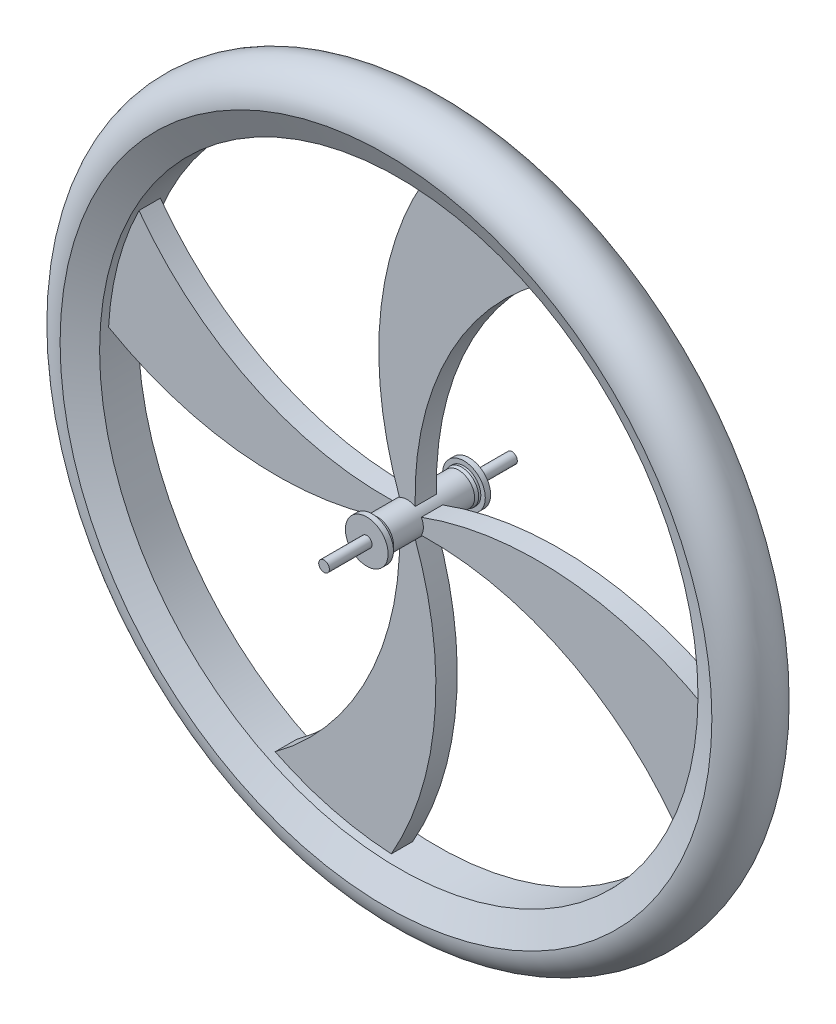
ISO-10303-21;
HEADER;
FILE_DESCRIPTION(('STEP AP214'),'2;1');
FILE_NAME('part.step','',(''),(''),'','','');
FILE_SCHEMA(('AUTOMOTIVE_DESIGN { 1 0 10303 214 1 1 1 1 }'));
ENDSEC;
DATA;
#1=APPLICATION_CONTEXT('core data for automotive mechanical design processes');
#2=APPLICATION_PROTOCOL_DEFINITION('international standard','automotive_design',2000,#1);
#3=PRODUCT_CONTEXT('',#1,'mechanical');
#4=PRODUCT('Part','Part','',(#3));
#5=PRODUCT_RELATED_PRODUCT_CATEGORY('part','',(#4));
#6=PRODUCT_DEFINITION_FORMATION('','',#4);
#7=PRODUCT_DEFINITION_CONTEXT('part definition',#1,'design');
#8=PRODUCT_DEFINITION('design','',#6,#7);
#9=PRODUCT_DEFINITION_SHAPE('','',#8);
#10=(LENGTH_UNIT() NAMED_UNIT(*) SI_UNIT(.MILLI.,.METRE.));
#11=(NAMED_UNIT(*) PLANE_ANGLE_UNIT() SI_UNIT($,.RADIAN.));
#12=(NAMED_UNIT(*) SI_UNIT($,.STERADIAN.) SOLID_ANGLE_UNIT());
#13=UNCERTAINTY_MEASURE_WITH_UNIT(LENGTH_MEASURE(1.E-05),#10,'distance_accuracy_value','');
#14=(GEOMETRIC_REPRESENTATION_CONTEXT(3) GLOBAL_UNCERTAINTY_ASSIGNED_CONTEXT((#13)) GLOBAL_UNIT_ASSIGNED_CONTEXT((#10,
#11,#12)) REPRESENTATION_CONTEXT('',''));
#15=CARTESIAN_POINT('',(0.,0.,0.));
#16=DIRECTION('',(0.,0.,1.));
#17=DIRECTION('',(1.,0.,0.));
#18=AXIS2_PLACEMENT_3D('',#15,#16,#17);
#19=CARTESIAN_POINT('',(0.,0.,38.));
#20=DIRECTION('',(0.,0.,-1.));
#21=DIRECTION('',(-1.,0.,0.));
#22=AXIS2_PLACEMENT_3D('',#19,#20,#21);
#23=CYLINDRICAL_SURFACE('',#22,15.);
#24=CARTESIAN_POINT('',(0.,0.,10.));
#25=DIRECTION('',(0.,0.,-1.));
#26=DIRECTION('',(-1.,0.,0.));
#27=AXIS2_PLACEMENT_3D('',#24,#25,#26);
#28=CIRCLE('',#27,15.0000000000005);
#29=CARTESIAN_POINT('',(7.32038317779105,-13.0924401900606,10.));
#30=VERTEX_POINT('',#29);
#31=CARTESIAN_POINT('',(-7.32038317780992,-13.0924401900512,10.));
#32=VERTEX_POINT('',#31);
#33=EDGE_CURVE('E188',#30,#32,#28,.T.);
#34=ORIENTED_EDGE('',*,*,#33,.F.);
#35=DIRECTION('',(0.,0.,-1.));
#36=VECTOR('',#35,1.);
#37=CARTESIAN_POINT('',(7.32038317779105,-13.0924401900606,10.));
#38=LINE('',#37,#36);
#39=CARTESIAN_POINT('',(7.32038317779105,-13.0924401900606,-10.));
#40=VERTEX_POINT('',#39);
#41=EDGE_CURVE('E201',#30,#40,#38,.T.);
#42=ORIENTED_EDGE('',*,*,#41,.T.);
#43=CARTESIAN_POINT('',(0.,0.,-10.));
#44=DIRECTION('',(0.,0.,-1.));
#45=DIRECTION('',(-1.,0.,0.));
#46=AXIS2_PLACEMENT_3D('',#43,#44,#45);
#47=CIRCLE('',#46,15.0000000000005);
#48=CARTESIAN_POINT('',(-7.3203831778094,-13.0924401900503,-10.));
#49=VERTEX_POINT('',#48);
#50=EDGE_CURVE('E177',#40,#49,#47,.T.);
#51=ORIENTED_EDGE('',*,*,#50,.T.);
#52=DIRECTION('',(0.,0.,-1.));
#53=VECTOR('',#52,1.);
#54=CARTESIAN_POINT('',(-7.32038317780992,-13.0924401900512,10.));
#55=LINE('',#54,#53);
#56=EDGE_CURVE('E222',#32,#49,#55,.T.);
#57=ORIENTED_EDGE('',*,*,#56,.F.);
#58=EDGE_LOOP('',(#34,#42,#51,#57));
#59=FACE_BOUND('',#58,.T.);
#60=CARTESIAN_POINT('',(0.,0.,10.));
#61=DIRECTION('',(0.,0.,-1.));
#62=DIRECTION('',(-1.,0.,0.));
#63=AXIS2_PLACEMENT_3D('',#60,#61,#62);
#64=CIRCLE('',#63,15.0000000000005);
#65=CARTESIAN_POINT('',(-7.3203831777911,13.0924401900605,10.));
#66=VERTEX_POINT('',#65);
#67=CARTESIAN_POINT('',(7.32038317780992,13.0924401900513,10.));
#68=VERTEX_POINT('',#67);
#69=EDGE_CURVE('E280',#66,#68,#64,.T.);
#70=ORIENTED_EDGE('',*,*,#69,.F.);
#71=DIRECTION('',(0.,0.,-1.));
#72=VECTOR('',#71,1.);
#73=CARTESIAN_POINT('',(-7.3203831777911,13.0924401900605,10.));
#74=LINE('',#73,#72);
#75=CARTESIAN_POINT('',(-7.3203831777911,13.0924401900605,-10.));
#76=VERTEX_POINT('',#75);
#77=EDGE_CURVE('E294',#66,#76,#74,.T.);
#78=ORIENTED_EDGE('',*,*,#77,.T.);
#79=CARTESIAN_POINT('',(0.,0.,-10.));
#80=DIRECTION('',(0.,0.,-1.));
#81=DIRECTION('',(-1.,0.,0.));
#82=AXIS2_PLACEMENT_3D('',#79,#80,#81);
#83=CIRCLE('',#82,15.0000000000005);
#84=CARTESIAN_POINT('',(7.32038317780938,13.0924401900503,-10.));
#85=VERTEX_POINT('',#84);
#86=EDGE_CURVE('E279',#76,#85,#83,.T.);
#87=ORIENTED_EDGE('',*,*,#86,.T.);
#88=DIRECTION('',(0.,0.,-1.));
#89=VECTOR('',#88,1.);
#90=CARTESIAN_POINT('',(7.32038317780992,13.0924401900513,10.));
#91=LINE('',#90,#89);
#92=EDGE_CURVE('E318',#68,#85,#91,.T.);
#93=ORIENTED_EDGE('',*,*,#92,.F.);
#94=EDGE_LOOP('',(#70,#78,#87,#93));
#95=FACE_BOUND('',#94,.T.);
#96=CARTESIAN_POINT('',(0.,0.,38.));
#97=DIRECTION('',(0.,0.,1.));
#98=DIRECTION('',(1.,0.,0.));
#99=AXIS2_PLACEMENT_3D('',#96,#97,#98);
#100=CIRCLE('',#99,15.);
#101=CARTESIAN_POINT('',(15.,0.,38.));
#102=VERTEX_POINT('',#101);
#103=EDGE_CURVE('E44',#102,#102,#100,.T.);
#104=ORIENTED_EDGE('',*,*,#103,.F.);
#105=EDGE_LOOP('',(#104));
#106=FACE_BOUND('',#105,.T.);
#107=CARTESIAN_POINT('',(0.,0.,-38.));
#108=DIRECTION('',(0.,0.,1.));
#109=DIRECTION('',(1.,0.,0.));
#110=AXIS2_PLACEMENT_3D('',#107,#108,#109);
#111=CIRCLE('',#110,15.);
#112=CARTESIAN_POINT('',(15.,0.,-38.));
#113=VERTEX_POINT('',#112);
#114=EDGE_CURVE('E331',#113,#113,#111,.T.);
#115=ORIENTED_EDGE('',*,*,#114,.T.);
#116=EDGE_LOOP('',(#115));
#117=FACE_BOUND('',#116,.T.);
#118=CARTESIAN_POINT('',(0.,0.,10.));
#119=DIRECTION('',(0.,0.,-1.));
#120=DIRECTION('',(-1.,0.,0.));
#121=AXIS2_PLACEMENT_3D('',#118,#119,#120);
#122=CIRCLE('',#121,15.0000000000005);
#123=CARTESIAN_POINT('',(13.0924401900606,7.32038317779105,10.));
#124=VERTEX_POINT('',#123);
#125=CARTESIAN_POINT('',(13.0924401900513,-7.32038317780992,10.));
#126=VERTEX_POINT('',#125);
#127=EDGE_CURVE('E226',#124,#126,#122,.T.);
#128=ORIENTED_EDGE('',*,*,#127,.F.);
#129=DIRECTION('',(0.,0.,-1.));
#130=VECTOR('',#129,1.);
#131=CARTESIAN_POINT('',(13.0924401900606,7.32038317779105,10.));
#132=LINE('',#131,#130);
#133=CARTESIAN_POINT('',(13.0924401900606,7.32038317779105,-10.));
#134=VERTEX_POINT('',#133);
#135=EDGE_CURVE('E240',#124,#134,#132,.T.);
#136=ORIENTED_EDGE('',*,*,#135,.T.);
#137=CARTESIAN_POINT('',(0.,0.,-10.));
#138=DIRECTION('',(0.,0.,-1.));
#139=DIRECTION('',(-1.,0.,0.));
#140=AXIS2_PLACEMENT_3D('',#137,#138,#139);
#141=CIRCLE('',#140,15.0000000000005);
#142=CARTESIAN_POINT('',(13.0924401900503,-7.3203831778094,-10.));
#143=VERTEX_POINT('',#142);
#144=EDGE_CURVE('E225',#134,#143,#141,.T.);
#145=ORIENTED_EDGE('',*,*,#144,.T.);
#146=DIRECTION('',(0.,0.,-1.));
#147=VECTOR('',#146,1.);
#148=CARTESIAN_POINT('',(13.0924401900513,-7.32038317780992,10.));
#149=LINE('',#148,#147);
#150=EDGE_CURVE('E264',#126,#143,#149,.T.);
#151=ORIENTED_EDGE('',*,*,#150,.F.);
#152=EDGE_LOOP('',(#128,#136,#145,#151));
#153=FACE_BOUND('',#152,.T.);
#154=CARTESIAN_POINT('',(0.,0.,10.));
#155=DIRECTION('',(0.,0.,-1.));
#156=DIRECTION('',(-1.,0.,0.));
#157=AXIS2_PLACEMENT_3D('',#154,#155,#156);
#158=CIRCLE('',#157,15.0000000000005);
#159=CARTESIAN_POINT('',(-13.0924401900606,-7.32038317779105,10.));
#160=VERTEX_POINT('',#159);
#161=CARTESIAN_POINT('',(-13.0924401900511,7.32038317780992,10.));
#162=VERTEX_POINT('',#161);
#163=EDGE_CURVE('E163',#160,#162,#158,.T.);
#164=ORIENTED_EDGE('',*,*,#163,.F.);
#165=DIRECTION('',(0.,0.,-1.));
#166=VECTOR('',#165,1.);
#167=CARTESIAN_POINT('',(-13.0924401900606,-7.32038317779105,10.));
#168=LINE('',#167,#166);
#169=CARTESIAN_POINT('',(-13.0924401900606,-7.32038317779105,-10.));
#170=VERTEX_POINT('',#169);
#171=EDGE_CURVE('E409',#160,#170,#168,.T.);
#172=ORIENTED_EDGE('',*,*,#171,.T.);
#173=CARTESIAN_POINT('',(0.,0.,-10.));
#174=DIRECTION('',(0.,0.,-1.));
#175=DIRECTION('',(-1.,0.,0.));
#176=AXIS2_PLACEMENT_3D('',#173,#174,#175);
#177=CIRCLE('',#176,15.0000000000005);
#178=CARTESIAN_POINT('',(-13.0924401900503,7.32038317780946,-10.));
#179=VERTEX_POINT('',#178);
#180=EDGE_CURVE('E175',#170,#179,#177,.T.);
#181=ORIENTED_EDGE('',*,*,#180,.T.);
#182=DIRECTION('',(0.,0.,-1.));
#183=VECTOR('',#182,1.);
#184=CARTESIAN_POINT('',(-13.0924401900511,7.32038317780992,10.));
#185=LINE('',#184,#183);
#186=EDGE_CURVE('E57',#162,#179,#185,.T.);
#187=ORIENTED_EDGE('',*,*,#186,.F.);
#188=EDGE_LOOP('',(#164,#172,#181,#187));
#189=FACE_BOUND('',#188,.T.);
#190=ADVANCED_FACE('F41',(#59,#95,#106,#117,#153,#189),#23,.T.);
#191=CARTESIAN_POINT('',(0.,0.,38.));
#192=DIRECTION('',(0.,0.,1.));
#193=DIRECTION('',(1.,0.,0.));
#194=AXIS2_PLACEMENT_3D('',#191,#192,#193);
#195=CYLINDRICAL_SURFACE('',#194,280.2);
#196=CARTESIAN_POINT('',(0.,0.,10.));
#197=DIRECTION('',(0.,0.,1.));
#198=DIRECTION('',(1.,0.,0.));
#199=AXIS2_PLACEMENT_3D('',#196,#197,#198);
#200=CIRCLE('',#199,280.2);
#201=CARTESIAN_POINT('',(-123.80858993279,-251.3632293293,10.));
#202=VERTEX_POINT('',#201);
#203=CARTESIAN_POINT('',(-15.0000000000228,-279.798213003584,10.));
#204=VERTEX_POINT('',#203);
#205=EDGE_CURVE('E196',#202,#204,#200,.T.);
#206=ORIENTED_EDGE('',*,*,#205,.F.);
#207=DIRECTION('',(0.,0.,-1.));
#208=VECTOR('',#207,1.);
#209=CARTESIAN_POINT('',(-123.80858993279,-251.3632293293,10.));
#210=LINE('',#209,#208);
#211=CARTESIAN_POINT('',(-123.80858993279,-251.3632293293,-10.));
#212=VERTEX_POINT('',#211);
#213=EDGE_CURVE('E218',#202,#212,#210,.T.);
#214=ORIENTED_EDGE('',*,*,#213,.T.);
#215=CARTESIAN_POINT('',(0.,0.,-10.));
#216=DIRECTION('',(0.,0.,1.));
#217=DIRECTION('',(1.,0.,0.));
#218=AXIS2_PLACEMENT_3D('',#215,#216,#217);
#219=CIRCLE('',#218,280.2);
#220=CARTESIAN_POINT('',(-15.0000000000229,-279.798213003584,-10.));
#221=VERTEX_POINT('',#220);
#222=EDGE_CURVE('E205',#212,#221,#219,.T.);
#223=ORIENTED_EDGE('',*,*,#222,.T.);
#224=DIRECTION('',(0.,0.,-1.));
#225=VECTOR('',#224,1.);
#226=CARTESIAN_POINT('',(-15.0000000000228,-279.798213003584,10.));
#227=LINE('',#226,#225);
#228=EDGE_CURVE('E214',#204,#221,#227,.T.);
#229=ORIENTED_EDGE('',*,*,#228,.F.);
#230=EDGE_LOOP('',(#206,#214,#223,#229));
#231=FACE_BOUND('',#230,.T.);
#232=DIRECTION('',(0.,0.,-1.));
#233=VECTOR('',#232,1.);
#234=CARTESIAN_POINT('',(15.0000000000229,279.798213003585,10.));
#235=LINE('',#234,#233);
#236=CARTESIAN_POINT('',(15.0000000000229,279.798213003585,10.));
#237=VERTEX_POINT('',#236);
#238=CARTESIAN_POINT('',(15.0000000000229,279.798213003585,-10.));
#239=VERTEX_POINT('',#238);
#240=EDGE_CURVE('E310',#237,#239,#235,.T.);
#241=ORIENTED_EDGE('',*,*,#240,.F.);
#242=CARTESIAN_POINT('',(0.,0.,10.));
#243=DIRECTION('',(0.,0.,1.));
#244=DIRECTION('',(1.,0.,0.));
#245=AXIS2_PLACEMENT_3D('',#242,#243,#244);
#246=CIRCLE('',#245,280.2);
#247=CARTESIAN_POINT('',(123.80858993279,251.3632293293,10.));
#248=VERTEX_POINT('',#247);
#249=EDGE_CURVE('E288',#248,#237,#246,.T.);
#250=ORIENTED_EDGE('',*,*,#249,.F.);
#251=DIRECTION('',(0.,0.,-1.));
#252=VECTOR('',#251,1.);
#253=CARTESIAN_POINT('',(123.80858993279,251.3632293293,10.));
#254=LINE('',#253,#252);
#255=CARTESIAN_POINT('',(123.80858993279,251.3632293293,-10.));
#256=VERTEX_POINT('',#255);
#257=EDGE_CURVE('E314',#248,#256,#254,.T.);
#258=ORIENTED_EDGE('',*,*,#257,.T.);
#259=CARTESIAN_POINT('',(0.,0.,-10.));
#260=DIRECTION('',(0.,0.,1.));
#261=DIRECTION('',(1.,0.,0.));
#262=AXIS2_PLACEMENT_3D('',#259,#260,#261);
#263=CIRCLE('',#262,280.2);
#264=EDGE_CURVE('E301',#256,#239,#263,.T.);
#265=ORIENTED_EDGE('',*,*,#264,.T.);
#266=EDGE_LOOP('',(#241,#250,#258,#265));
#267=FACE_BOUND('',#266,.T.);
#268=CARTESIAN_POINT('',(0.,0.,18.));
#269=DIRECTION('',(0.,0.,1.));
#270=DIRECTION('',(1.,0.,0.));
#271=AXIS2_PLACEMENT_3D('',#268,#269,#270);
#272=CIRCLE('',#271,280.2);
#273=CARTESIAN_POINT('',(280.2,0.,18.));
#274=VERTEX_POINT('',#273);
#275=EDGE_CURVE('E271',#274,#274,#272,.T.);
#276=ORIENTED_EDGE('',*,*,#275,.T.);
#277=EDGE_LOOP('',(#276));
#278=FACE_BOUND('',#277,.T.);
#279=CARTESIAN_POINT('',(0.,0.,-18.));
#280=DIRECTION('',(0.,0.,1.));
#281=DIRECTION('',(1.,0.,0.));
#282=AXIS2_PLACEMENT_3D('',#279,#280,#281);
#283=CIRCLE('',#282,280.2);
#284=CARTESIAN_POINT('',(280.2,0.,-18.));
#285=VERTEX_POINT('',#284);
#286=EDGE_CURVE('E275',#285,#285,#283,.T.);
#287=ORIENTED_EDGE('',*,*,#286,.F.);
#288=EDGE_LOOP('',(#287));
#289=FACE_BOUND('',#288,.T.);
#290=CARTESIAN_POINT('',(0.,0.,10.));
#291=DIRECTION('',(0.,0.,1.));
#292=DIRECTION('',(1.,0.,0.));
#293=AXIS2_PLACEMENT_3D('',#290,#291,#292);
#294=CIRCLE('',#293,280.2);
#295=CARTESIAN_POINT('',(251.3632293293,-123.80858993279,10.));
#296=VERTEX_POINT('',#295);
#297=CARTESIAN_POINT('',(279.798213003585,-15.0000000000229,10.));
#298=VERTEX_POINT('',#297);
#299=EDGE_CURVE('E234',#296,#298,#294,.T.);
#300=ORIENTED_EDGE('',*,*,#299,.F.);
#301=DIRECTION('',(0.,0.,-1.));
#302=VECTOR('',#301,1.);
#303=CARTESIAN_POINT('',(251.3632293293,-123.80858993279,10.));
#304=LINE('',#303,#302);
#305=CARTESIAN_POINT('',(251.3632293293,-123.80858993279,-10.));
#306=VERTEX_POINT('',#305);
#307=EDGE_CURVE('E260',#296,#306,#304,.T.);
#308=ORIENTED_EDGE('',*,*,#307,.T.);
#309=CARTESIAN_POINT('',(0.,0.,-10.));
#310=DIRECTION('',(0.,0.,1.));
#311=DIRECTION('',(1.,0.,0.));
#312=AXIS2_PLACEMENT_3D('',#309,#310,#311);
#313=CIRCLE('',#312,280.2);
#314=CARTESIAN_POINT('',(279.798213003585,-15.0000000000229,-10.));
#315=VERTEX_POINT('',#314);
#316=EDGE_CURVE('E247',#306,#315,#313,.T.);
#317=ORIENTED_EDGE('',*,*,#316,.T.);
#318=DIRECTION('',(0.,0.,-1.));
#319=VECTOR('',#318,1.);
#320=CARTESIAN_POINT('',(279.798213003585,-15.0000000000229,10.));
#321=LINE('',#320,#319);
#322=EDGE_CURVE('E256',#298,#315,#321,.T.);
#323=ORIENTED_EDGE('',*,*,#322,.F.);
#324=EDGE_LOOP('',(#300,#308,#317,#323));
#325=FACE_BOUND('',#324,.T.);
#326=CARTESIAN_POINT('',(0.,0.,10.));
#327=DIRECTION('',(0.,0.,1.));
#328=DIRECTION('',(1.,0.,0.));
#329=AXIS2_PLACEMENT_3D('',#326,#327,#328);
#330=CIRCLE('',#329,280.2);
#331=CARTESIAN_POINT('',(-251.3632293293,123.80858993279,10.));
#332=VERTEX_POINT('',#331);
#333=CARTESIAN_POINT('',(-279.798213003585,15.0000000000229,10.));
#334=VERTEX_POINT('',#333);
#335=EDGE_CURVE('E162',#332,#334,#330,.T.);
#336=ORIENTED_EDGE('',*,*,#335,.F.);
#337=DIRECTION('',(0.,0.,-1.));
#338=VECTOR('',#337,1.);
#339=CARTESIAN_POINT('',(-251.3632293293,123.80858993279,10.));
#340=LINE('',#339,#338);
#341=CARTESIAN_POINT('',(-251.3632293293,123.80858993279,-10.));
#342=VERTEX_POINT('',#341);
#343=EDGE_CURVE('E158',#332,#342,#340,.T.);
#344=ORIENTED_EDGE('',*,*,#343,.T.);
#345=CARTESIAN_POINT('',(0.,0.,-10.));
#346=DIRECTION('',(0.,0.,1.));
#347=DIRECTION('',(1.,0.,0.));
#348=AXIS2_PLACEMENT_3D('',#345,#346,#347);
#349=CIRCLE('',#348,280.2);
#350=CARTESIAN_POINT('',(-279.798213003585,15.0000000000229,-10.));
#351=VERTEX_POINT('',#350);
#352=EDGE_CURVE('E418',#342,#351,#349,.T.);
#353=ORIENTED_EDGE('',*,*,#352,.T.);
#354=DIRECTION('',(0.,0.,-1.));
#355=VECTOR('',#354,1.);
#356=CARTESIAN_POINT('',(-279.798213003585,15.0000000000229,10.));
#357=LINE('',#356,#355);
#358=EDGE_CURVE('E184',#334,#351,#357,.T.);
#359=ORIENTED_EDGE('',*,*,#358,.F.);
#360=EDGE_LOOP('',(#336,#344,#353,#359));
#361=FACE_BOUND('',#360,.T.);
#362=ADVANCED_FACE('F377',(#231,#267,#278,#289,#325,#361),#195,.F.);
#363=CARTESIAN_POINT('',(0.,0.,38.));
#364=DIRECTION('',(0.,0.,1.));
#365=DIRECTION('',(1.,0.,0.));
#366=AXIS2_PLACEMENT_3D('',#363,#364,#365);
#367=CONICAL_SURFACE('',#366,15.,0.26179938779915);
#368=CARTESIAN_POINT('',(0.,0.,41.));
#369=DIRECTION('',(0.,0.,1.));
#370=DIRECTION('',(1.,0.,0.));
#371=AXIS2_PLACEMENT_3D('',#368,#369,#370);
#372=CIRCLE('',#371,15.8038475772934);
#373=CARTESIAN_POINT('',(15.8038475772934,0.,41.));
#374=VERTEX_POINT('',#373);
#375=EDGE_CURVE('E364',#374,#374,#372,.T.);
#376=ORIENTED_EDGE('',*,*,#375,.F.);
#377=EDGE_LOOP('',(#376));
#378=FACE_BOUND('',#377,.T.);
#379=ORIENTED_EDGE('',*,*,#103,.T.);
#380=EDGE_LOOP('',(#379));
#381=FACE_BOUND('',#380,.T.);
#382=ADVANCED_FACE('F373',(#378,#381),#367,.T.);
#383=CARTESIAN_POINT('',(0.,0.,43.));
#384=DIRECTION('',(0.,0.,-1.));
#385=DIRECTION('',(-1.,0.,0.));
#386=AXIS2_PLACEMENT_3D('',#383,#384,#385);
#387=CYLINDRICAL_SURFACE('',#386,15.8038475772934);
#388=CARTESIAN_POINT('',(0.,0.,43.));
#389=DIRECTION('',(0.,0.,1.));
#390=DIRECTION('',(1.,0.,0.));
#391=AXIS2_PLACEMENT_3D('',#388,#389,#390);
#392=CIRCLE('',#391,15.8038475772934);
#393=CARTESIAN_POINT('',(15.8038475772934,0.,43.));
#394=VERTEX_POINT('',#393);
#395=EDGE_CURVE('E358',#394,#394,#392,.T.);
#396=ORIENTED_EDGE('',*,*,#395,.F.);
#397=EDGE_LOOP('',(#396));
#398=FACE_BOUND('',#397,.T.);
#399=ORIENTED_EDGE('',*,*,#375,.T.);
#400=EDGE_LOOP('',(#399));
#401=FACE_BOUND('',#400,.T.);
#402=ADVANCED_FACE('F538',(#398,#401),#387,.T.);
#403=CARTESIAN_POINT('',(0.,0.,48.));
#404=DIRECTION('',(0.,0.,-1.));
#405=DIRECTION('',(-1.,0.,0.));
#406=AXIS2_PLACEMENT_3D('',#403,#404,#405);
#407=CYLINDRICAL_SURFACE('',#406,20.);
#408=CARTESIAN_POINT('',(0.,0.,48.));
#409=DIRECTION('',(0.,0.,1.));
#410=DIRECTION('',(1.,0.,0.));
#411=AXIS2_PLACEMENT_3D('',#408,#409,#410);
#412=CIRCLE('',#411,20.);
#413=CARTESIAN_POINT('',(20.,0.,48.));
#414=VERTEX_POINT('',#413);
#415=EDGE_CURVE('E354',#414,#414,#412,.T.);
#416=ORIENTED_EDGE('',*,*,#415,.F.);
#417=EDGE_LOOP('',(#416));
#418=FACE_BOUND('',#417,.T.);
#419=CARTESIAN_POINT('',(0.,0.,43.));
#420=DIRECTION('',(0.,0.,1.));
#421=DIRECTION('',(1.,0.,0.));
#422=AXIS2_PLACEMENT_3D('',#419,#420,#421);
#423=CIRCLE('',#422,20.);
#424=CARTESIAN_POINT('',(20.,0.,43.));
#425=VERTEX_POINT('',#424);
#426=EDGE_CURVE('E352',#425,#425,#423,.T.);
#427=ORIENTED_EDGE('',*,*,#426,.T.);
#428=EDGE_LOOP('',(#427));
#429=FACE_BOUND('',#428,.T.);
#430=ADVANCED_FACE('F531',(#418,#429),#407,.T.);
#431=CARTESIAN_POINT('',(0.,0.,48.));
#432=DIRECTION('',(0.,0.,1.));
#433=DIRECTION('',(1.,0.,0.));
#434=AXIS2_PLACEMENT_3D('',#431,#432,#433);
#435=PLANE('',#434);
#436=CARTESIAN_POINT('',(0.,0.,48.));
#437=DIRECTION('',(0.,0.,1.));
#438=DIRECTION('',(1.,0.,0.));
#439=AXIS2_PLACEMENT_3D('',#436,#437,#438);
#440=CIRCLE('',#439,5.);
#441=CARTESIAN_POINT('',(5.,0.,48.));
#442=VERTEX_POINT('',#441);
#443=EDGE_CURVE('E11',#442,#442,#440,.T.);
#444=ORIENTED_EDGE('',*,*,#443,.F.);
#445=EDGE_LOOP('',(#444));
#446=FACE_BOUND('',#445,.T.);
#447=ORIENTED_EDGE('',*,*,#415,.T.);
#448=EDGE_LOOP('',(#447));
#449=FACE_BOUND('',#448,.T.);
#450=ADVANCED_FACE('F528',(#446,#449),#435,.T.);
#451=CARTESIAN_POINT('',(0.,0.,43.));
#452=DIRECTION('',(0.,0.,1.));
#453=DIRECTION('',(1.,0.,0.));
#454=AXIS2_PLACEMENT_3D('',#451,#452,#453);
#455=PLANE('',#454);
#456=ORIENTED_EDGE('',*,*,#395,.T.);
#457=EDGE_LOOP('',(#456));
#458=FACE_BOUND('',#457,.T.);
#459=ORIENTED_EDGE('',*,*,#426,.F.);
#460=EDGE_LOOP('',(#459));
#461=FACE_BOUND('',#460,.T.);
#462=ADVANCED_FACE('F526',(#458,#461),#455,.F.);
#463=CARTESIAN_POINT('',(0.,0.,88.));
#464=DIRECTION('',(0.,0.,-1.));
#465=DIRECTION('',(-1.,0.,0.));
#466=AXIS2_PLACEMENT_3D('',#463,#464,#465);
#467=CYLINDRICAL_SURFACE('',#466,5.);
#468=CARTESIAN_POINT('',(0.,0.,88.));
#469=DIRECTION('',(0.,0.,1.));
#470=DIRECTION('',(1.,0.,0.));
#471=AXIS2_PLACEMENT_3D('',#468,#469,#470);
#472=CIRCLE('',#471,5.);
#473=CARTESIAN_POINT('',(5.,0.,88.));
#474=VERTEX_POINT('',#473);
#475=EDGE_CURVE('E330',#474,#474,#472,.T.);
#476=ORIENTED_EDGE('',*,*,#475,.F.);
#477=EDGE_LOOP('',(#476));
#478=FACE_BOUND('',#477,.T.);
#479=ORIENTED_EDGE('',*,*,#443,.T.);
#480=EDGE_LOOP('',(#479));
#481=FACE_BOUND('',#480,.T.);
#482=ADVANCED_FACE('F522',(#478,#481),#467,.T.);
#483=CARTESIAN_POINT('',(0.,0.,88.));
#484=DIRECTION('',(0.,0.,1.));
#485=DIRECTION('',(1.,0.,0.));
#486=AXIS2_PLACEMENT_3D('',#483,#484,#485);
#487=PLANE('',#486);
#488=ORIENTED_EDGE('',*,*,#475,.T.);
#489=EDGE_LOOP('',(#488));
#490=FACE_BOUND('',#489,.T.);
#491=ADVANCED_FACE('F518',(#490),#487,.T.);
#492=CARTESIAN_POINT('',(0.,0.,-38.));
#493=DIRECTION('',(0.,0.,-1.));
#494=DIRECTION('',(1.,0.,0.));
#495=AXIS2_PLACEMENT_3D('',#492,#493,#494);
#496=CONICAL_SURFACE('',#495,15.,0.26179938779915);
#497=CARTESIAN_POINT('',(0.,0.,-41.));
#498=DIRECTION('',(0.,0.,1.));
#499=DIRECTION('',(1.,0.,0.));
#500=AXIS2_PLACEMENT_3D('',#497,#498,#499);
#501=CIRCLE('',#500,15.8038475772934);
#502=CARTESIAN_POINT('',(15.8038475772934,0.,-41.));
#503=VERTEX_POINT('',#502);
#504=EDGE_CURVE('E343',#503,#503,#501,.T.);
#505=ORIENTED_EDGE('',*,*,#504,.T.);
#506=EDGE_LOOP('',(#505));
#507=FACE_BOUND('',#506,.T.);
#508=ORIENTED_EDGE('',*,*,#114,.F.);
#509=EDGE_LOOP('',(#508));
#510=FACE_BOUND('',#509,.T.);
#511=ADVANCED_FACE('F514',(#507,#510),#496,.T.);
#512=CARTESIAN_POINT('',(0.,0.,-43.));
#513=DIRECTION('',(0.,0.,1.));
#514=DIRECTION('',(-1.,0.,0.));
#515=AXIS2_PLACEMENT_3D('',#512,#513,#514);
#516=CYLINDRICAL_SURFACE('',#515,15.8038475772934);
#517=CARTESIAN_POINT('',(0.,0.,-43.));
#518=DIRECTION('',(0.,0.,1.));
#519=DIRECTION('',(1.,0.,0.));
#520=AXIS2_PLACEMENT_3D('',#517,#518,#519);
#521=CIRCLE('',#520,15.8038475772934);
#522=CARTESIAN_POINT('',(15.8038475772934,0.,-43.));
#523=VERTEX_POINT('',#522);
#524=EDGE_CURVE('E336',#523,#523,#521,.T.);
#525=ORIENTED_EDGE('',*,*,#524,.T.);
#526=EDGE_LOOP('',(#525));
#527=FACE_BOUND('',#526,.T.);
#528=ORIENTED_EDGE('',*,*,#504,.F.);
#529=EDGE_LOOP('',(#528));
#530=FACE_BOUND('',#529,.T.);
#531=ADVANCED_FACE('F510',(#527,#530),#516,.T.);
#532=CARTESIAN_POINT('',(0.,0.,-48.));
#533=DIRECTION('',(0.,0.,1.));
#534=DIRECTION('',(-1.,0.,0.));
#535=AXIS2_PLACEMENT_3D('',#532,#533,#534);
#536=CYLINDRICAL_SURFACE('',#535,20.);
#537=CARTESIAN_POINT('',(0.,0.,-48.));
#538=DIRECTION('',(0.,0.,1.));
#539=DIRECTION('',(1.,0.,0.));
#540=AXIS2_PLACEMENT_3D('',#537,#538,#539);
#541=CIRCLE('',#540,20.);
#542=CARTESIAN_POINT('',(20.,0.,-48.));
#543=VERTEX_POINT('',#542);
#544=EDGE_CURVE('E332',#543,#543,#541,.T.);
#545=ORIENTED_EDGE('',*,*,#544,.T.);
#546=EDGE_LOOP('',(#545));
#547=FACE_BOUND('',#546,.T.);
#548=CARTESIAN_POINT('',(0.,0.,-43.));
#549=DIRECTION('',(0.,0.,1.));
#550=DIRECTION('',(1.,0.,0.));
#551=AXIS2_PLACEMENT_3D('',#548,#549,#550);
#552=CIRCLE('',#551,20.);
#553=CARTESIAN_POINT('',(20.,0.,-43.));
#554=VERTEX_POINT('',#553);
#555=EDGE_CURVE('E325',#554,#554,#552,.T.);
#556=ORIENTED_EDGE('',*,*,#555,.F.);
#557=EDGE_LOOP('',(#556));
#558=FACE_BOUND('',#557,.T.);
#559=ADVANCED_FACE('F503',(#547,#558),#536,.T.);
#560=CARTESIAN_POINT('',(0.,0.,-48.));
#561=DIRECTION('',(0.,0.,-1.));
#562=DIRECTION('',(1.,0.,0.));
#563=AXIS2_PLACEMENT_3D('',#560,#561,#562);
#564=PLANE('',#563);
#565=CARTESIAN_POINT('',(0.,0.,-48.));
#566=DIRECTION('',(0.,0.,1.));
#567=DIRECTION('',(1.,0.,0.));
#568=AXIS2_PLACEMENT_3D('',#565,#566,#567);
#569=CIRCLE('',#568,5.);
#570=CARTESIAN_POINT('',(5.,0.,-48.));
#571=VERTEX_POINT('',#570);
#572=EDGE_CURVE('E326',#571,#571,#569,.T.);
#573=ORIENTED_EDGE('',*,*,#572,.T.);
#574=EDGE_LOOP('',(#573));
#575=FACE_BOUND('',#574,.T.);
#576=ORIENTED_EDGE('',*,*,#544,.F.);
#577=EDGE_LOOP('',(#576));
#578=FACE_BOUND('',#577,.T.);
#579=ADVANCED_FACE('F500',(#575,#578),#564,.T.);
#580=CARTESIAN_POINT('',(0.,0.,-43.));
#581=DIRECTION('',(0.,0.,-1.));
#582=DIRECTION('',(1.,0.,0.));
#583=AXIS2_PLACEMENT_3D('',#580,#581,#582);
#584=PLANE('',#583);
#585=ORIENTED_EDGE('',*,*,#524,.F.);
#586=EDGE_LOOP('',(#585));
#587=FACE_BOUND('',#586,.T.);
#588=ORIENTED_EDGE('',*,*,#555,.T.);
#589=EDGE_LOOP('',(#588));
#590=FACE_BOUND('',#589,.T.);
#591=ADVANCED_FACE('F498',(#587,#590),#584,.F.);
#592=CARTESIAN_POINT('',(0.,0.,-88.));
#593=DIRECTION('',(0.,0.,1.));
#594=DIRECTION('',(-1.,0.,0.));
#595=AXIS2_PLACEMENT_3D('',#592,#593,#594);
#596=CYLINDRICAL_SURFACE('',#595,5.);
#597=CARTESIAN_POINT('',(0.,0.,-88.));
#598=DIRECTION('',(0.,0.,1.));
#599=DIRECTION('',(1.,0.,0.));
#600=AXIS2_PLACEMENT_3D('',#597,#598,#599);
#601=CIRCLE('',#600,5.);
#602=CARTESIAN_POINT('',(5.,0.,-88.));
#603=VERTEX_POINT('',#602);
#604=EDGE_CURVE('E321',#603,#603,#601,.T.);
#605=ORIENTED_EDGE('',*,*,#604,.T.);
#606=EDGE_LOOP('',(#605));
#607=FACE_BOUND('',#606,.T.);
#608=ORIENTED_EDGE('',*,*,#572,.F.);
#609=EDGE_LOOP('',(#608));
#610=FACE_BOUND('',#609,.T.);
#611=ADVANCED_FACE('F494',(#607,#610),#596,.T.);
#612=CARTESIAN_POINT('',(0.,0.,-88.));
#613=DIRECTION('',(0.,0.,-1.));
#614=DIRECTION('',(1.,0.,0.));
#615=AXIS2_PLACEMENT_3D('',#612,#613,#614);
#616=PLANE('',#615);
#617=ORIENTED_EDGE('',*,*,#604,.F.);
#618=EDGE_LOOP('',(#617));
#619=FACE_BOUND('',#618,.T.);
#620=ADVANCED_FACE('F490',(#619),#616,.T.);
#621=CARTESIAN_POINT('',(293.437777743411,20.8228608065085,10.));
#622=DIRECTION('',(0.,0.,-1.));
#623=DIRECTION('',(-1.,0.,0.));
#624=AXIS2_PLACEMENT_3D('',#621,#622,#623);
#625=CYLINDRICAL_SURFACE('',#624,286.221807128519);
#626=CARTESIAN_POINT('',(293.437777743411,20.8228608065085,-10.));
#627=DIRECTION('',(0.,0.,-1.));
#628=DIRECTION('',(-1.,0.,0.));
#629=AXIS2_PLACEMENT_3D('',#626,#627,#628);
#630=CIRCLE('',#629,286.221807128519);
#631=EDGE_CURVE('E298',#85,#256,#630,.T.);
#632=ORIENTED_EDGE('',*,*,#631,.T.);
#633=ORIENTED_EDGE('',*,*,#257,.F.);
#634=CARTESIAN_POINT('',(293.437777743411,20.8228608065085,10.));
#635=DIRECTION('',(0.,0.,-1.));
#636=DIRECTION('',(-1.,0.,0.));
#637=AXIS2_PLACEMENT_3D('',#634,#635,#636);
#638=CIRCLE('',#637,286.221807128519);
#639=EDGE_CURVE('E284',#68,#248,#638,.T.);
#640=ORIENTED_EDGE('',*,*,#639,.F.);
#641=ORIENTED_EDGE('',*,*,#92,.T.);
#642=EDGE_LOOP('',(#632,#633,#640,#641));
#643=FACE_BOUND('',#642,.T.);
#644=ADVANCED_FACE('F486',(#643),#625,.F.);
#645=CARTESIAN_POINT('',(290.8994051033,122.421548913097,10.));
#646=DIRECTION('',(0.,0.,-1.));
#647=DIRECTION('',(-1.,0.,0.));
#648=AXIS2_PLACEMENT_3D('',#645,#646,#647);
#649=CYLINDRICAL_SURFACE('',#648,317.628550569045);
#650=CARTESIAN_POINT('',(290.8994051033,122.421548913097,-10.));
#651=DIRECTION('',(0.,0.,1.));
#652=DIRECTION('',(-1.,0.,0.));
#653=AXIS2_PLACEMENT_3D('',#650,#651,#652);
#654=CIRCLE('',#653,317.628550569045);
#655=EDGE_CURVE('E285',#239,#76,#654,.T.);
#656=ORIENTED_EDGE('',*,*,#655,.T.);
#657=ORIENTED_EDGE('',*,*,#77,.F.);
#658=CARTESIAN_POINT('',(290.8994051033,122.421548913097,10.));
#659=DIRECTION('',(0.,0.,1.));
#660=DIRECTION('',(-1.,0.,0.));
#661=AXIS2_PLACEMENT_3D('',#658,#659,#660);
#662=CIRCLE('',#661,317.628550569045);
#663=EDGE_CURVE('E291',#237,#66,#662,.T.);
#664=ORIENTED_EDGE('',*,*,#663,.F.);
#665=ORIENTED_EDGE('',*,*,#240,.T.);
#666=EDGE_LOOP('',(#656,#657,#664,#665));
#667=FACE_BOUND('',#666,.T.);
#668=ADVANCED_FACE('F479',(#667),#649,.T.);
#669=CARTESIAN_POINT('',(146.718888871705,10.4114304032543,10.));
#670=DIRECTION('',(0.,0.,-1.));
#671=DIRECTION('',(-1.,0.,0.));
#672=AXIS2_PLACEMENT_3D('',#669,#670,#671);
#673=PLANE('',#672);
#674=ORIENTED_EDGE('',*,*,#69,.T.);
#675=ORIENTED_EDGE('',*,*,#639,.T.);
#676=ORIENTED_EDGE('',*,*,#249,.T.);
#677=ORIENTED_EDGE('',*,*,#663,.T.);
#678=EDGE_LOOP('',(#674,#675,#676,#677));
#679=FACE_BOUND('',#678,.T.);
#680=ADVANCED_FACE('F476',(#679),#673,.F.);
#681=CARTESIAN_POINT('',(146.718888871705,10.4114304032543,-10.));
#682=DIRECTION('',(0.,0.,-1.));
#683=DIRECTION('',(-1.,0.,0.));
#684=AXIS2_PLACEMENT_3D('',#681,#682,#683);
#685=PLANE('',#684);
#686=ORIENTED_EDGE('',*,*,#86,.F.);
#687=ORIENTED_EDGE('',*,*,#655,.F.);
#688=ORIENTED_EDGE('',*,*,#264,.F.);
#689=ORIENTED_EDGE('',*,*,#631,.F.);
#690=EDGE_LOOP('',(#686,#687,#688,#689));
#691=FACE_BOUND('',#690,.T.);
#692=ADVANCED_FACE('F474',(#691),#685,.T.);
#693=CARTESIAN_POINT('',(0.,0.,-18.));
#694=DIRECTION('',(0.,0.,-1.));
#695=DIRECTION('',(-1.,0.,0.));
#696=AXIS2_PLACEMENT_3D('',#693,#694,#695);
#697=CONICAL_SURFACE('',#696,280.2,1.12327635163773);
#698=CARTESIAN_POINT('',(0.,0.,-30.));
#699=DIRECTION('',(0.,0.,1.));
#700=DIRECTION('',(1.,0.,0.));
#701=AXIS2_PLACEMENT_3D('',#698,#699,#700);
#702=CIRCLE('',#701,305.2);
#703=CARTESIAN_POINT('',(305.2,0.,-30.));
#704=VERTEX_POINT('',#703);
#705=EDGE_CURVE('E267',#704,#704,#702,.T.);
#706=ORIENTED_EDGE('',*,*,#705,.F.);
#707=EDGE_LOOP('',(#706));
#708=FACE_BOUND('',#707,.T.);
#709=ORIENTED_EDGE('',*,*,#286,.T.);
#710=EDGE_LOOP('',(#709));
#711=FACE_BOUND('',#710,.T.);
#712=ADVANCED_FACE('F469',(#708,#711),#697,.F.);
#713=CARTESIAN_POINT('',(0.,0.,30.));
#714=DIRECTION('',(0.,0.,1.));
#715=DIRECTION('',(1.,0.,0.));
#716=AXIS2_PLACEMENT_3D('',#713,#714,#715);
#717=CONICAL_SURFACE('',#716,305.2,1.12327635163773);
#718=ORIENTED_EDGE('',*,*,#275,.F.);
#719=EDGE_LOOP('',(#718));
#720=FACE_BOUND('',#719,.T.);
#721=CARTESIAN_POINT('',(0.,0.,30.));
#722=DIRECTION('',(0.,0.,1.));
#723=DIRECTION('',(1.,0.,0.));
#724=AXIS2_PLACEMENT_3D('',#721,#722,#723);
#725=CIRCLE('',#724,305.2);
#726=CARTESIAN_POINT('',(305.2,0.,30.));
#727=VERTEX_POINT('',#726);
#728=EDGE_CURVE('E415',#727,#727,#725,.T.);
#729=ORIENTED_EDGE('',*,*,#728,.T.);
#730=EDGE_LOOP('',(#729));
#731=FACE_BOUND('',#730,.T.);
#732=ADVANCED_FACE('F467',(#720,#731),#717,.F.);
#733=CARTESIAN_POINT('',(20.8228608065086,-293.437777743411,10.));
#734=DIRECTION('',(0.,0.,-1.));
#735=DIRECTION('',(-1.,0.,0.));
#736=AXIS2_PLACEMENT_3D('',#733,#734,#735);
#737=CYLINDRICAL_SURFACE('',#736,286.221807128519);
#738=CARTESIAN_POINT('',(20.8228608065086,-293.437777743411,-10.));
#739=DIRECTION('',(0.,0.,-1.));
#740=DIRECTION('',(-1.,0.,0.));
#741=AXIS2_PLACEMENT_3D('',#738,#739,#740);
#742=CIRCLE('',#741,286.221807128519);
#743=EDGE_CURVE('E244',#143,#306,#742,.T.);
#744=ORIENTED_EDGE('',*,*,#743,.T.);
#745=ORIENTED_EDGE('',*,*,#307,.F.);
#746=CARTESIAN_POINT('',(20.8228608065086,-293.437777743411,10.));
#747=DIRECTION('',(0.,0.,-1.));
#748=DIRECTION('',(-1.,0.,0.));
#749=AXIS2_PLACEMENT_3D('',#746,#747,#748);
#750=CIRCLE('',#749,286.221807128519);
#751=EDGE_CURVE('E230',#126,#296,#750,.T.);
#752=ORIENTED_EDGE('',*,*,#751,.F.);
#753=ORIENTED_EDGE('',*,*,#150,.T.);
#754=EDGE_LOOP('',(#744,#745,#752,#753));
#755=FACE_BOUND('',#754,.T.);
#756=ADVANCED_FACE('F398',(#755),#737,.F.);
#757=CARTESIAN_POINT('',(122.421548913097,-290.8994051033,10.));
#758=DIRECTION('',(0.,0.,-1.));
#759=DIRECTION('',(-1.,0.,0.));
#760=AXIS2_PLACEMENT_3D('',#757,#758,#759);
#761=CYLINDRICAL_SURFACE('',#760,317.628550569045);
#762=CARTESIAN_POINT('',(122.421548913097,-290.8994051033,-10.));
#763=DIRECTION('',(0.,0.,1.));
#764=DIRECTION('',(-1.,0.,0.));
#765=AXIS2_PLACEMENT_3D('',#762,#763,#764);
#766=CIRCLE('',#765,317.628550569045);
#767=EDGE_CURVE('E231',#315,#134,#766,.T.);
#768=ORIENTED_EDGE('',*,*,#767,.T.);
#769=ORIENTED_EDGE('',*,*,#135,.F.);
#770=CARTESIAN_POINT('',(122.421548913097,-290.8994051033,10.));
#771=DIRECTION('',(0.,0.,1.));
#772=DIRECTION('',(-1.,0.,0.));
#773=AXIS2_PLACEMENT_3D('',#770,#771,#772);
#774=CIRCLE('',#773,317.628550569045);
#775=EDGE_CURVE('E237',#298,#124,#774,.T.);
#776=ORIENTED_EDGE('',*,*,#775,.F.);
#777=ORIENTED_EDGE('',*,*,#322,.T.);
#778=EDGE_LOOP('',(#768,#769,#776,#777));
#779=FACE_BOUND('',#778,.T.);
#780=ADVANCED_FACE('F391',(#779),#761,.T.);
#781=CARTESIAN_POINT('',(10.4114304032543,-146.718888871705,10.));
#782=DIRECTION('',(0.,0.,-1.));
#783=DIRECTION('',(-1.,0.,0.));
#784=AXIS2_PLACEMENT_3D('',#781,#782,#783);
#785=PLANE('',#784);
#786=ORIENTED_EDGE('',*,*,#127,.T.);
#787=ORIENTED_EDGE('',*,*,#751,.T.);
#788=ORIENTED_EDGE('',*,*,#299,.T.);
#789=ORIENTED_EDGE('',*,*,#775,.T.);
#790=EDGE_LOOP('',(#786,#787,#788,#789));
#791=FACE_BOUND('',#790,.T.);
#792=ADVANCED_FACE('F385',(#791),#785,.F.);
#793=CARTESIAN_POINT('',(10.4114304032543,-146.718888871705,-10.));
#794=DIRECTION('',(0.,0.,-1.));
#795=DIRECTION('',(-1.,0.,0.));
#796=AXIS2_PLACEMENT_3D('',#793,#794,#795);
#797=PLANE('',#796);
#798=ORIENTED_EDGE('',*,*,#144,.F.);
#799=ORIENTED_EDGE('',*,*,#767,.F.);
#800=ORIENTED_EDGE('',*,*,#316,.F.);
#801=ORIENTED_EDGE('',*,*,#743,.F.);
#802=EDGE_LOOP('',(#798,#799,#800,#801));
#803=FACE_BOUND('',#802,.T.);
#804=ADVANCED_FACE('F396',(#803),#797,.T.);
#805=CARTESIAN_POINT('',(-293.437777743411,-20.8228608065086,10.));
#806=DIRECTION('',(0.,0.,-1.));
#807=DIRECTION('',(-1.,0.,0.));
#808=AXIS2_PLACEMENT_3D('',#805,#806,#807);
#809=CYLINDRICAL_SURFACE('',#808,286.221807128519);
#810=CARTESIAN_POINT('',(-293.437777743411,-20.8228608065086,-10.));
#811=DIRECTION('',(0.,0.,-1.));
#812=DIRECTION('',(-1.,0.,0.));
#813=AXIS2_PLACEMENT_3D('',#810,#811,#812);
#814=CIRCLE('',#813,286.221807128519);
#815=EDGE_CURVE('E182',#49,#212,#814,.T.);
#816=ORIENTED_EDGE('',*,*,#815,.T.);
#817=ORIENTED_EDGE('',*,*,#213,.F.);
#818=CARTESIAN_POINT('',(-293.437777743411,-20.8228608065086,10.));
#819=DIRECTION('',(0.,0.,-1.));
#820=DIRECTION('',(-1.,0.,0.));
#821=AXIS2_PLACEMENT_3D('',#818,#819,#820);
#822=CIRCLE('',#821,286.221807128519);
#823=EDGE_CURVE('E192',#32,#202,#822,.T.);
#824=ORIENTED_EDGE('',*,*,#823,.F.);
#825=ORIENTED_EDGE('',*,*,#56,.T.);
#826=EDGE_LOOP('',(#816,#817,#824,#825));
#827=FACE_BOUND('',#826,.T.);
#828=ADVANCED_FACE('F454',(#827),#809,.F.);
#829=CARTESIAN_POINT('',(-290.8994051033,-122.421548913097,10.));
#830=DIRECTION('',(0.,0.,-1.));
#831=DIRECTION('',(-1.,0.,0.));
#832=AXIS2_PLACEMENT_3D('',#829,#830,#831);
#833=CYLINDRICAL_SURFACE('',#832,317.628550569045);
#834=CARTESIAN_POINT('',(-290.8994051033,-122.421548913097,-10.));
#835=DIRECTION('',(0.,0.,1.));
#836=DIRECTION('',(-1.,0.,0.));
#837=AXIS2_PLACEMENT_3D('',#834,#835,#836);
#838=CIRCLE('',#837,317.628550569045);
#839=EDGE_CURVE('E193',#221,#40,#838,.T.);
#840=ORIENTED_EDGE('',*,*,#839,.T.);
#841=ORIENTED_EDGE('',*,*,#41,.F.);
#842=CARTESIAN_POINT('',(-290.8994051033,-122.421548913097,10.));
#843=DIRECTION('',(0.,0.,1.));
#844=DIRECTION('',(-1.,0.,0.));
#845=AXIS2_PLACEMENT_3D('',#842,#843,#844);
#846=CIRCLE('',#845,317.628550569045);
#847=EDGE_CURVE('E199',#204,#30,#846,.T.);
#848=ORIENTED_EDGE('',*,*,#847,.F.);
#849=ORIENTED_EDGE('',*,*,#228,.T.);
#850=EDGE_LOOP('',(#840,#841,#848,#849));
#851=FACE_BOUND('',#850,.T.);
#852=ADVANCED_FACE('F447',(#851),#833,.T.);
#853=CARTESIAN_POINT('',(-146.718888871705,-10.4114304032543,10.));
#854=DIRECTION('',(0.,0.,-1.));
#855=DIRECTION('',(-1.,0.,0.));
#856=AXIS2_PLACEMENT_3D('',#853,#854,#855);
#857=PLANE('',#856);
#858=ORIENTED_EDGE('',*,*,#33,.T.);
#859=ORIENTED_EDGE('',*,*,#823,.T.);
#860=ORIENTED_EDGE('',*,*,#205,.T.);
#861=ORIENTED_EDGE('',*,*,#847,.T.);
#862=EDGE_LOOP('',(#858,#859,#860,#861));
#863=FACE_BOUND('',#862,.T.);
#864=ADVANCED_FACE('F444',(#863),#857,.F.);
#865=CARTESIAN_POINT('',(-146.718888871705,-10.4114304032543,-10.));
#866=DIRECTION('',(0.,0.,-1.));
#867=DIRECTION('',(-1.,0.,0.));
#868=AXIS2_PLACEMENT_3D('',#865,#866,#867);
#869=PLANE('',#868);
#870=ORIENTED_EDGE('',*,*,#50,.F.);
#871=ORIENTED_EDGE('',*,*,#839,.F.);
#872=ORIENTED_EDGE('',*,*,#222,.F.);
#873=ORIENTED_EDGE('',*,*,#815,.F.);
#874=EDGE_LOOP('',(#870,#871,#872,#873));
#875=FACE_BOUND('',#874,.T.);
#876=ADVANCED_FACE('F443',(#875),#869,.T.);
#877=CARTESIAN_POINT('',(-20.8228608065086,293.437777743411,10.));
#878=DIRECTION('',(0.,0.,-1.));
#879=DIRECTION('',(-1.,0.,0.));
#880=AXIS2_PLACEMENT_3D('',#877,#878,#879);
#881=CYLINDRICAL_SURFACE('',#880,286.221807128519);
#882=CARTESIAN_POINT('',(-20.8228608065086,293.437777743411,-10.));
#883=DIRECTION('',(0.,0.,-1.));
#884=DIRECTION('',(-1.,0.,0.));
#885=AXIS2_PLACEMENT_3D('',#882,#883,#884);
#886=CIRCLE('',#885,286.221807128519);
#887=EDGE_CURVE('E414',#179,#342,#886,.T.);
#888=ORIENTED_EDGE('',*,*,#887,.T.);
#889=ORIENTED_EDGE('',*,*,#343,.F.);
#890=CARTESIAN_POINT('',(-20.8228608065086,293.437777743411,10.));
#891=DIRECTION('',(0.,0.,-1.));
#892=DIRECTION('',(-1.,0.,0.));
#893=AXIS2_PLACEMENT_3D('',#890,#891,#892);
#894=CIRCLE('',#893,286.221807128519);
#895=EDGE_CURVE('E154',#162,#332,#894,.T.);
#896=ORIENTED_EDGE('',*,*,#895,.F.);
#897=ORIENTED_EDGE('',*,*,#186,.T.);
#898=EDGE_LOOP('',(#888,#889,#896,#897));
#899=FACE_BOUND('',#898,.T.);
#900=ADVANCED_FACE('F156',(#899),#881,.F.);
#901=CARTESIAN_POINT('',(-122.421548913097,290.8994051033,10.));
#902=DIRECTION('',(0.,0.,-1.));
#903=DIRECTION('',(-1.,0.,0.));
#904=AXIS2_PLACEMENT_3D('',#901,#902,#903);
#905=CYLINDRICAL_SURFACE('',#904,317.628550569045);
#906=CARTESIAN_POINT('',(-122.421548913097,290.8994051033,-10.));
#907=DIRECTION('',(0.,0.,1.));
#908=DIRECTION('',(-1.,0.,0.));
#909=AXIS2_PLACEMENT_3D('',#906,#907,#908);
#910=CIRCLE('',#909,317.628550569045);
#911=EDGE_CURVE('E65',#351,#170,#910,.T.);
#912=ORIENTED_EDGE('',*,*,#911,.T.);
#913=ORIENTED_EDGE('',*,*,#171,.F.);
#914=CARTESIAN_POINT('',(-122.421548913097,290.8994051033,10.));
#915=DIRECTION('',(0.,0.,1.));
#916=DIRECTION('',(-1.,0.,0.));
#917=AXIS2_PLACEMENT_3D('',#914,#915,#916);
#918=CIRCLE('',#917,317.628550569045);
#919=EDGE_CURVE('E168',#334,#160,#918,.T.);
#920=ORIENTED_EDGE('',*,*,#919,.F.);
#921=ORIENTED_EDGE('',*,*,#358,.T.);
#922=EDGE_LOOP('',(#912,#913,#920,#921));
#923=FACE_BOUND('',#922,.T.);
#924=ADVANCED_FACE('F426',(#923),#905,.T.);
#925=CARTESIAN_POINT('',(-10.4114304032543,146.718888871705,10.));
#926=DIRECTION('',(0.,0.,-1.));
#927=DIRECTION('',(-1.,0.,0.));
#928=AXIS2_PLACEMENT_3D('',#925,#926,#927);
#929=PLANE('',#928);
#930=ORIENTED_EDGE('',*,*,#163,.T.);
#931=ORIENTED_EDGE('',*,*,#895,.T.);
#932=ORIENTED_EDGE('',*,*,#335,.T.);
#933=ORIENTED_EDGE('',*,*,#919,.T.);
#934=EDGE_LOOP('',(#930,#931,#932,#933));
#935=FACE_BOUND('',#934,.T.);
#936=ADVANCED_FACE('F166',(#935),#929,.F.);
#937=CARTESIAN_POINT('',(-10.4114304032543,146.718888871705,-10.));
#938=DIRECTION('',(0.,0.,-1.));
#939=DIRECTION('',(-1.,0.,0.));
#940=AXIS2_PLACEMENT_3D('',#937,#938,#939);
#941=PLANE('',#940);
#942=ORIENTED_EDGE('',*,*,#180,.F.);
#943=ORIENTED_EDGE('',*,*,#911,.F.);
#944=ORIENTED_EDGE('',*,*,#352,.F.);
#945=ORIENTED_EDGE('',*,*,#887,.F.);
#946=EDGE_LOOP('',(#942,#943,#944,#945));
#947=FACE_BOUND('',#946,.T.);
#948=ADVANCED_FACE('F427',(#947),#941,.T.);
#949=CARTESIAN_POINT('',(0.,0.,0.));
#950=DIRECTION('',(0.,0.,1.));
#951=DIRECTION('',(1.,0.,0.));
#952=AXIS2_PLACEMENT_3D('',#949,#950,#951);
#953=TOROIDAL_SURFACE('',#952,305.2,30.);
#954=ORIENTED_EDGE('',*,*,#705,.T.);
#955=EDGE_LOOP('',(#954));
#956=FACE_BOUND('',#955,.T.);
#957=ORIENTED_EDGE('',*,*,#728,.F.);
#958=EDGE_LOOP('',(#957));
#959=FACE_BOUND('',#958,.T.);
#960=ADVANCED_FACE('F429',(#956,#959),#953,.T.);
#961=CLOSED_SHELL('',(#190,#362,#382,#402,#430,#450,#462,#482,#491,#511,#531,#559,#579,#591,
#611,#620,#644,#668,#680,#692,#712,#732,#756,#780,#792,#804,#828,#852,#864,#876,#900,#924,#936,
#948,#960));
#962=MANIFOLD_SOLID_BREP('B2',#961);
#963=ADVANCED_BREP_SHAPE_REPRESENTATION('',(#18,#962),#14);
#964=SHAPE_DEFINITION_REPRESENTATION(#9,#963);
ENDSEC;
END-ISO-10303-21;
